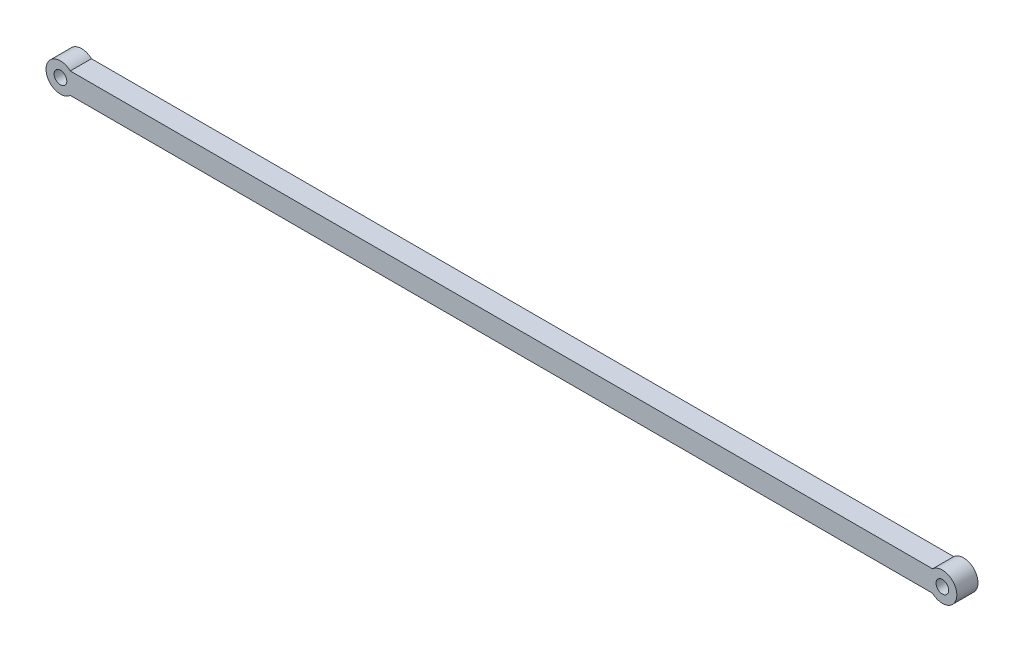
ISO-10303-21;
HEADER;
FILE_DESCRIPTION(('STEP AP214'),'2;1');
FILE_NAME('part.step','',(''),(''),'','','');
FILE_SCHEMA(('AUTOMOTIVE_DESIGN { 1 0 10303 214 1 1 1 1 }'));
ENDSEC;
DATA;
#1=APPLICATION_CONTEXT('core data for automotive mechanical design processes');
#2=APPLICATION_PROTOCOL_DEFINITION('international standard','automotive_design',2000,#1);
#3=PRODUCT_CONTEXT('',#1,'mechanical');
#4=PRODUCT('Part','Part','',(#3));
#5=PRODUCT_RELATED_PRODUCT_CATEGORY('part','',(#4));
#6=PRODUCT_DEFINITION_FORMATION('','',#4);
#7=PRODUCT_DEFINITION_CONTEXT('part definition',#1,'design');
#8=PRODUCT_DEFINITION('design','',#6,#7);
#9=PRODUCT_DEFINITION_SHAPE('','',#8);
#10=(LENGTH_UNIT() NAMED_UNIT(*) SI_UNIT(.MILLI.,.METRE.));
#11=(NAMED_UNIT(*) PLANE_ANGLE_UNIT() SI_UNIT($,.RADIAN.));
#12=(NAMED_UNIT(*) SI_UNIT($,.STERADIAN.) SOLID_ANGLE_UNIT());
#13=UNCERTAINTY_MEASURE_WITH_UNIT(LENGTH_MEASURE(1.E-05),#10,'distance_accuracy_value','');
#14=(GEOMETRIC_REPRESENTATION_CONTEXT(3) GLOBAL_UNCERTAINTY_ASSIGNED_CONTEXT((#13)) GLOBAL_UNIT_ASSIGNED_CONTEXT((#10,
#11,#12)) REPRESENTATION_CONTEXT('',''));
#15=CARTESIAN_POINT('',(0.,0.,0.));
#16=DIRECTION('',(0.,0.,1.));
#17=DIRECTION('',(1.,0.,0.));
#18=AXIS2_PLACEMENT_3D('',#15,#16,#17);
#19=CARTESIAN_POINT('',(-290.957,-6.985,6.985));
#20=DIRECTION('',(0.,-1.,0.));
#21=DIRECTION('',(0.,0.,-1.));
#22=AXIS2_PLACEMENT_3D('',#19,#20,#21);
#23=PLANE('',#22);
#24=DIRECTION('',(1.,0.,0.));
#25=VECTOR('',#24,1.);
#26=CARTESIAN_POINT('',(-290.957,-6.985,6.985));
#27=LINE('',#26,#25);
#28=CARTESIAN_POINT('',(-284.481245217737,-6.985,6.985));
#29=VERTEX_POINT('',#28);
#30=CARTESIAN_POINT('',(284.481245217737,-6.985,6.985));
#31=VERTEX_POINT('',#30);
#32=EDGE_CURVE('E794',#29,#31,#27,.T.);
#33=ORIENTED_EDGE('',*,*,#32,.F.);
#34=DIRECTION('',(0.,0.,1.));
#35=VECTOR('',#34,1.);
#36=CARTESIAN_POINT('',(-284.481245217737,-6.985,-33.9257683632075));
#37=LINE('',#36,#35);
#38=CARTESIAN_POINT('',(-284.481245217737,-6.985,-6.985));
#39=VERTEX_POINT('',#38);
#40=EDGE_CURVE('E811',#29,#39,#37,.F.);
#41=ORIENTED_EDGE('',*,*,#40,.T.);
#42=DIRECTION('',(1.,0.,0.));
#43=VECTOR('',#42,1.);
#44=CARTESIAN_POINT('',(-290.957,-6.985,-6.985));
#45=LINE('',#44,#43);
#46=CARTESIAN_POINT('',(284.481245217737,-6.985,-6.985));
#47=VERTEX_POINT('',#46);
#48=EDGE_CURVE('E786',#39,#47,#45,.T.);
#49=ORIENTED_EDGE('',*,*,#48,.T.);
#50=DIRECTION('',(0.,0.,1.));
#51=VECTOR('',#50,1.);
#52=CARTESIAN_POINT('',(284.481245217737,-6.985,-33.9257683632075));
#53=LINE('',#52,#51);
#54=EDGE_CURVE('E826',#31,#47,#53,.F.);
#55=ORIENTED_EDGE('',*,*,#54,.F.);
#56=EDGE_LOOP('',(#33,#41,#49,#55));
#57=FACE_BOUND('',#56,.T.);
#58=ADVANCED_FACE('F772',(#57),#23,.T.);
#59=CARTESIAN_POINT('',(-290.957,6.985,6.985));
#60=DIRECTION('',(0.,1.,0.));
#61=DIRECTION('',(0.,0.,1.));
#62=AXIS2_PLACEMENT_3D('',#59,#60,#61);
#63=PLANE('',#62);
#64=DIRECTION('',(1.,0.,0.));
#65=VECTOR('',#64,1.);
#66=CARTESIAN_POINT('',(-290.957,6.985,-6.985));
#67=LINE('',#66,#65);
#68=CARTESIAN_POINT('',(-284.481245217737,6.985,-6.985));
#69=VERTEX_POINT('',#68);
#70=CARTESIAN_POINT('',(284.481245217737,6.985,-6.985));
#71=VERTEX_POINT('',#70);
#72=EDGE_CURVE('E829',#69,#71,#67,.T.);
#73=ORIENTED_EDGE('',*,*,#72,.F.);
#74=DIRECTION('',(0.,0.,1.));
#75=VECTOR('',#74,1.);
#76=CARTESIAN_POINT('',(-284.481245217737,6.985,-33.9257683632075));
#77=LINE('',#76,#75);
#78=CARTESIAN_POINT('',(-284.481245217737,6.985,6.985));
#79=VERTEX_POINT('',#78);
#80=EDGE_CURVE('E12',#69,#79,#77,.T.);
#81=ORIENTED_EDGE('',*,*,#80,.T.);
#82=DIRECTION('',(1.,0.,0.));
#83=VECTOR('',#82,1.);
#84=CARTESIAN_POINT('',(-290.957,6.985,6.985));
#85=LINE('',#84,#83);
#86=CARTESIAN_POINT('',(284.481245217737,6.985,6.985));
#87=VERTEX_POINT('',#86);
#88=EDGE_CURVE('E823',#79,#87,#85,.T.);
#89=ORIENTED_EDGE('',*,*,#88,.T.);
#90=DIRECTION('',(0.,0.,1.));
#91=VECTOR('',#90,1.);
#92=CARTESIAN_POINT('',(284.481245217737,6.985,-33.9257683632075));
#93=LINE('',#92,#91);
#94=EDGE_CURVE('E776',#71,#87,#93,.T.);
#95=ORIENTED_EDGE('',*,*,#94,.F.);
#96=EDGE_LOOP('',(#73,#81,#89,#95));
#97=FACE_BOUND('',#96,.T.);
#98=ADVANCED_FACE('F855',(#97),#63,.T.);
#99=CARTESIAN_POINT('',(-290.957,-6.985,-6.985));
#100=DIRECTION('',(0.,0.,-1.));
#101=DIRECTION('',(-1.,0.,0.));
#102=AXIS2_PLACEMENT_3D('',#99,#100,#101);
#103=PLANE('',#102);
#104=CARTESIAN_POINT('',(-290.957,0.,-6.985));
#105=DIRECTION('',(0.,0.,-1.));
#106=DIRECTION('',(-1.,0.,0.));
#107=AXIS2_PLACEMENT_3D('',#104,#105,#106);
#108=CIRCLE('',#107,4.19099999999997);
#109=CARTESIAN_POINT('',(-295.148,0.,-6.985));
#110=VERTEX_POINT('',#109);
#111=EDGE_CURVE('E822',#110,#110,#108,.T.);
#112=ORIENTED_EDGE('',*,*,#111,.F.);
#113=EDGE_LOOP('',(#112));
#114=FACE_BOUND('',#113,.T.);
#115=ORIENTED_EDGE('',*,*,#48,.F.);
#116=CARTESIAN_POINT('',(-290.957,0.,-6.985));
#117=DIRECTION('',(0.,0.,-1.));
#118=DIRECTION('',(-1.,0.,0.));
#119=AXIS2_PLACEMENT_3D('',#116,#117,#118);
#120=CIRCLE('',#119,9.52500000000002);
#121=EDGE_CURVE('E820',#39,#69,#120,.T.);
#122=ORIENTED_EDGE('',*,*,#121,.T.);
#123=ORIENTED_EDGE('',*,*,#72,.T.);
#124=CARTESIAN_POINT('',(290.957,0.,-6.985));
#125=DIRECTION('',(0.,0.,-1.));
#126=DIRECTION('',(-1.,0.,0.));
#127=AXIS2_PLACEMENT_3D('',#124,#125,#126);
#128=CIRCLE('',#127,9.52500000000002);
#129=EDGE_CURVE('E842',#47,#71,#128,.F.);
#130=ORIENTED_EDGE('',*,*,#129,.F.);
#131=EDGE_LOOP('',(#115,#122,#123,#130));
#132=FACE_BOUND('',#131,.T.);
#133=CARTESIAN_POINT('',(290.957,0.,-6.985));
#134=DIRECTION('',(0.,0.,1.));
#135=DIRECTION('',(1.,0.,0.));
#136=AXIS2_PLACEMENT_3D('',#133,#134,#135);
#137=CIRCLE('',#136,4.19099999999997);
#138=CARTESIAN_POINT('',(295.148,0.,-6.985));
#139=VERTEX_POINT('',#138);
#140=EDGE_CURVE('E841',#139,#139,#137,.T.);
#141=ORIENTED_EDGE('',*,*,#140,.T.);
#142=EDGE_LOOP('',(#141));
#143=FACE_BOUND('',#142,.T.);
#144=ADVANCED_FACE('F774',(#114,#132,#143),#103,.T.);
#145=CARTESIAN_POINT('',(-290.957,-6.985,6.985));
#146=DIRECTION('',(0.,0.,1.));
#147=DIRECTION('',(1.,0.,0.));
#148=AXIS2_PLACEMENT_3D('',#145,#146,#147);
#149=PLANE('',#148);
#150=CARTESIAN_POINT('',(-290.957,0.,6.985));
#151=DIRECTION('',(0.,0.,-1.));
#152=DIRECTION('',(-1.,0.,0.));
#153=AXIS2_PLACEMENT_3D('',#150,#151,#152);
#154=CIRCLE('',#153,4.19099999999997);
#155=CARTESIAN_POINT('',(-295.148,0.,6.985));
#156=VERTEX_POINT('',#155);
#157=EDGE_CURVE('E885',#156,#156,#154,.T.);
#158=ORIENTED_EDGE('',*,*,#157,.T.);
#159=EDGE_LOOP('',(#158));
#160=FACE_BOUND('',#159,.T.);
#161=CARTESIAN_POINT('',(-290.957,0.,6.985));
#162=DIRECTION('',(0.,0.,1.));
#163=DIRECTION('',(1.,0.,0.));
#164=AXIS2_PLACEMENT_3D('',#161,#162,#163);
#165=CIRCLE('',#164,9.52500000000002);
#166=EDGE_CURVE('E814',#29,#79,#165,.F.);
#167=ORIENTED_EDGE('',*,*,#166,.F.);
#168=ORIENTED_EDGE('',*,*,#32,.T.);
#169=CARTESIAN_POINT('',(290.957,0.,6.985));
#170=DIRECTION('',(0.,0.,1.));
#171=DIRECTION('',(1.,0.,0.));
#172=AXIS2_PLACEMENT_3D('',#169,#170,#171);
#173=CIRCLE('',#172,9.52500000000002);
#174=EDGE_CURVE('E836',#31,#87,#173,.T.);
#175=ORIENTED_EDGE('',*,*,#174,.T.);
#176=ORIENTED_EDGE('',*,*,#88,.F.);
#177=EDGE_LOOP('',(#167,#168,#175,#176));
#178=FACE_BOUND('',#177,.T.);
#179=CARTESIAN_POINT('',(290.957,0.,6.985));
#180=DIRECTION('',(0.,0.,1.));
#181=DIRECTION('',(1.,0.,0.));
#182=AXIS2_PLACEMENT_3D('',#179,#180,#181);
#183=CIRCLE('',#182,4.19099999999997);
#184=CARTESIAN_POINT('',(295.148,0.,6.985));
#185=VERTEX_POINT('',#184);
#186=EDGE_CURVE('E816',#185,#185,#183,.T.);
#187=ORIENTED_EDGE('',*,*,#186,.F.);
#188=EDGE_LOOP('',(#187));
#189=FACE_BOUND('',#188,.T.);
#190=ADVANCED_FACE('F821',(#160,#178,#189),#149,.T.);
#191=CARTESIAN_POINT('',(290.957,0.,-33.9257683632075));
#192=DIRECTION('',(0.,0.,1.));
#193=DIRECTION('',(1.,0.,0.));
#194=AXIS2_PLACEMENT_3D('',#191,#192,#193);
#195=CYLINDRICAL_SURFACE('',#194,9.52500000000002);
#196=ORIENTED_EDGE('',*,*,#174,.F.);
#197=ORIENTED_EDGE('',*,*,#54,.T.);
#198=ORIENTED_EDGE('',*,*,#129,.T.);
#199=ORIENTED_EDGE('',*,*,#94,.T.);
#200=EDGE_LOOP('',(#196,#197,#198,#199));
#201=FACE_BOUND('',#200,.T.);
#202=ADVANCED_FACE('F839',(#201),#195,.T.);
#203=CARTESIAN_POINT('',(290.957,0.,-6.985));
#204=DIRECTION('',(0.,0.,1.));
#205=DIRECTION('',(1.,0.,0.));
#206=AXIS2_PLACEMENT_3D('',#203,#204,#205);
#207=CYLINDRICAL_SURFACE('',#206,4.19099999999997);
#208=ORIENTED_EDGE('',*,*,#140,.F.);
#209=EDGE_LOOP('',(#208));
#210=FACE_BOUND('',#209,.T.);
#211=ORIENTED_EDGE('',*,*,#186,.T.);
#212=EDGE_LOOP('',(#211));
#213=FACE_BOUND('',#212,.T.);
#214=ADVANCED_FACE('F866',(#210,#213),#207,.F.);
#215=CARTESIAN_POINT('',(-290.957,0.,-33.9257683632075));
#216=DIRECTION('',(0.,0.,1.));
#217=DIRECTION('',(1.,0.,0.));
#218=AXIS2_PLACEMENT_3D('',#215,#216,#217);
#219=CYLINDRICAL_SURFACE('',#218,9.52500000000002);
#220=ORIENTED_EDGE('',*,*,#40,.F.);
#221=ORIENTED_EDGE('',*,*,#166,.T.);
#222=ORIENTED_EDGE('',*,*,#80,.F.);
#223=ORIENTED_EDGE('',*,*,#121,.F.);
#224=EDGE_LOOP('',(#220,#221,#222,#223));
#225=FACE_BOUND('',#224,.T.);
#226=ADVANCED_FACE('F815',(#225),#219,.T.);
#227=CARTESIAN_POINT('',(-290.957,0.,-6.985));
#228=DIRECTION('',(0.,0.,1.));
#229=DIRECTION('',(1.,0.,0.));
#230=AXIS2_PLACEMENT_3D('',#227,#228,#229);
#231=CYLINDRICAL_SURFACE('',#230,4.19099999999997);
#232=ORIENTED_EDGE('',*,*,#111,.T.);
#233=EDGE_LOOP('',(#232));
#234=FACE_BOUND('',#233,.T.);
#235=ORIENTED_EDGE('',*,*,#157,.F.);
#236=EDGE_LOOP('',(#235));
#237=FACE_BOUND('',#236,.T.);
#238=ADVANCED_FACE('F875',(#234,#237),#231,.F.);
#239=CLOSED_SHELL('',(#58,#98,#144,#190,#202,#214,#226,#238));
#240=MANIFOLD_SOLID_BREP('B2',#239);
#241=ADVANCED_BREP_SHAPE_REPRESENTATION('',(#18,#240),#14);
#242=SHAPE_DEFINITION_REPRESENTATION(#9,#241);
ENDSEC;
END-ISO-10303-21;
